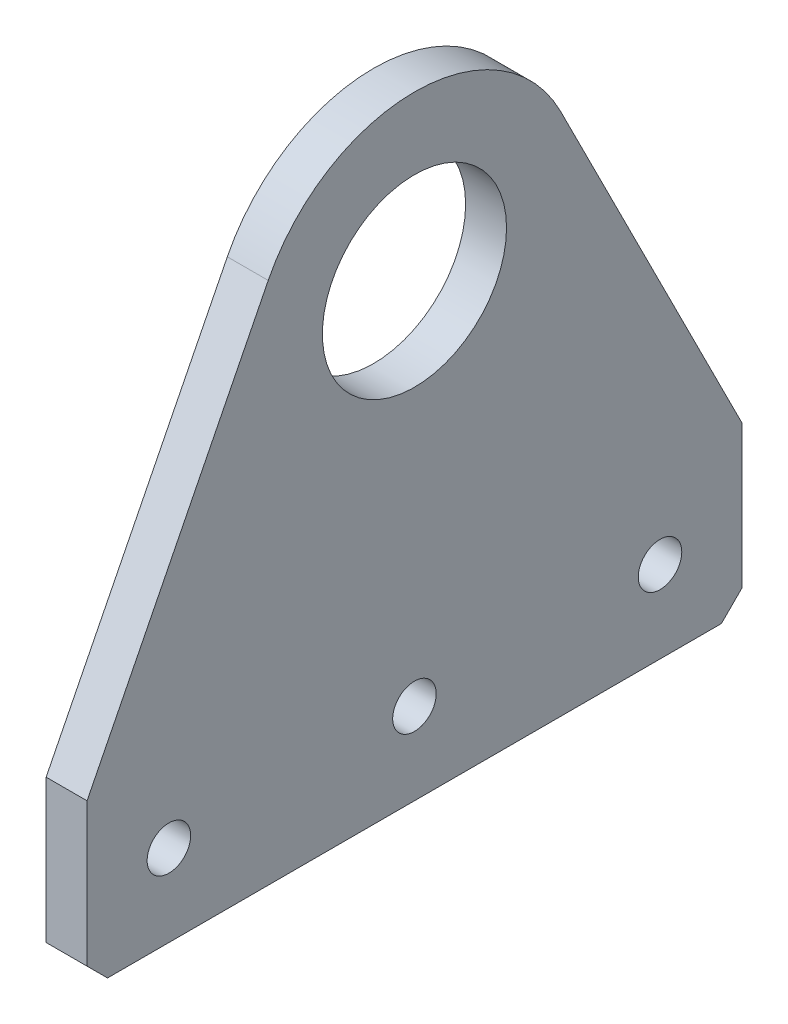
ISO-10303-21;
HEADER;
FILE_DESCRIPTION(('STEP AP214'),'2;1');
FILE_NAME('part.step','',(''),(''),'','','');
FILE_SCHEMA(('AUTOMOTIVE_DESIGN { 1 0 10303 214 1 1 1 1 }'));
ENDSEC;
DATA;
#1=APPLICATION_CONTEXT('core data for automotive mechanical design processes');
#2=APPLICATION_PROTOCOL_DEFINITION('international standard','automotive_design',2000,#1);
#3=PRODUCT_CONTEXT('',#1,'mechanical');
#4=PRODUCT('Part','Part','',(#3));
#5=PRODUCT_RELATED_PRODUCT_CATEGORY('part','',(#4));
#6=PRODUCT_DEFINITION_FORMATION('','',#4);
#7=PRODUCT_DEFINITION_CONTEXT('part definition',#1,'design');
#8=PRODUCT_DEFINITION('design','',#6,#7);
#9=PRODUCT_DEFINITION_SHAPE('','',#8);
#10=(LENGTH_UNIT() NAMED_UNIT(*) SI_UNIT(.MILLI.,.METRE.));
#11=(NAMED_UNIT(*) PLANE_ANGLE_UNIT() SI_UNIT($,.RADIAN.));
#12=(NAMED_UNIT(*) SI_UNIT($,.STERADIAN.) SOLID_ANGLE_UNIT());
#13=UNCERTAINTY_MEASURE_WITH_UNIT(LENGTH_MEASURE(1.E-05),#10,'distance_accuracy_value','');
#14=(GEOMETRIC_REPRESENTATION_CONTEXT(3) GLOBAL_UNCERTAINTY_ASSIGNED_CONTEXT((#13)) GLOBAL_UNIT_ASSIGNED_CONTEXT((#10,
#11,#12)) REPRESENTATION_CONTEXT('',''));
#15=CARTESIAN_POINT('',(0.,0.,0.));
#16=DIRECTION('',(0.,0.,1.));
#17=DIRECTION('',(1.,0.,0.));
#18=AXIS2_PLACEMENT_3D('',#15,#16,#17);
#19=CARTESIAN_POINT('',(6.35,69.85,-50.8));
#20=DIRECTION('',(-1.,0.,0.));
#21=DIRECTION('',(0.,0.,1.));
#22=AXIS2_PLACEMENT_3D('',#19,#20,#21);
#23=PLANE('',#22);
#24=CARTESIAN_POINT('',(6.35,12.7,-12.7));
#25=DIRECTION('',(1.,0.,0.));
#26=DIRECTION('',(0.,0.,-1.));
#27=AXIS2_PLACEMENT_3D('',#24,#25,#26);
#28=CIRCLE('',#27,3.3782);
#29=CARTESIAN_POINT('',(6.35,12.7,-16.0782));
#30=VERTEX_POINT('',#29);
#31=EDGE_CURVE('E236',#30,#30,#28,.T.);
#32=ORIENTED_EDGE('',*,*,#31,.F.);
#33=EDGE_LOOP('',(#32));
#34=FACE_BOUND('',#33,.T.);
#35=CARTESIAN_POINT('',(6.35,12.7,-50.8));
#36=DIRECTION('',(1.,0.,0.));
#37=DIRECTION('',(0.,0.,-1.));
#38=AXIS2_PLACEMENT_3D('',#35,#36,#37);
#39=CIRCLE('',#38,3.3782);
#40=CARTESIAN_POINT('',(6.35,12.7,-54.1782));
#41=VERTEX_POINT('',#40);
#42=EDGE_CURVE('E245',#41,#41,#39,.T.);
#43=ORIENTED_EDGE('',*,*,#42,.F.);
#44=EDGE_LOOP('',(#43));
#45=FACE_BOUND('',#44,.T.);
#46=CARTESIAN_POINT('',(6.35,12.7,-88.9));
#47=DIRECTION('',(1.,0.,0.));
#48=DIRECTION('',(0.,0.,-1.));
#49=AXIS2_PLACEMENT_3D('',#46,#47,#48);
#50=CIRCLE('',#49,3.37819999999999);
#51=CARTESIAN_POINT('',(6.35,12.7,-92.2782));
#52=VERTEX_POINT('',#51);
#53=EDGE_CURVE('E239',#52,#52,#50,.T.);
#54=ORIENTED_EDGE('',*,*,#53,.F.);
#55=EDGE_LOOP('',(#54));
#56=FACE_BOUND('',#55,.T.);
#57=DIRECTION('',(0.,0.,-1.));
#58=VECTOR('',#57,1.);
#59=CARTESIAN_POINT('',(6.35,0.,-101.6));
#60=LINE('',#59,#58);
#61=CARTESIAN_POINT('',(6.35,0.,-3.17500000000001));
#62=VERTEX_POINT('',#61);
#63=CARTESIAN_POINT('',(6.35,0.,-98.425));
#64=VERTEX_POINT('',#63);
#65=EDGE_CURVE('E118',#62,#64,#60,.T.);
#66=ORIENTED_EDGE('',*,*,#65,.T.);
#67=DIRECTION('',(0.,-0.707106781186548,0.707106781186548));
#68=VECTOR('',#67,1.);
#69=CARTESIAN_POINT('',(6.35,3.17500000000001,-101.6));
#70=LINE('',#69,#68);
#71=CARTESIAN_POINT('',(6.35,3.17500000000001,-101.6));
#72=VERTEX_POINT('',#71);
#73=EDGE_CURVE('E50',#64,#72,#70,.F.);
#74=ORIENTED_EDGE('',*,*,#73,.T.);
#75=DIRECTION('',(0.,1.,0.));
#76=VECTOR('',#75,1.);
#77=CARTESIAN_POINT('',(6.35,25.4,-101.6));
#78=LINE('',#77,#76);
#79=CARTESIAN_POINT('',(6.35,25.4,-101.6));
#80=VERTEX_POINT('',#79);
#81=EDGE_CURVE('E108',#72,#80,#78,.T.);
#82=ORIENTED_EDGE('',*,*,#81,.T.);
#83=DIRECTION('',(0.,0.893292076217458,0.449476658534237));
#84=VECTOR('',#83,1.);
#85=CARTESIAN_POINT('',(6.35,81.2667071267696,-73.4896187359234));
#86=LINE('',#85,#84);
#87=CARTESIAN_POINT('',(6.35,81.2667071267696,-73.4896187359234));
#88=VERTEX_POINT('',#87);
#89=EDGE_CURVE('E112',#80,#88,#86,.T.);
#90=ORIENTED_EDGE('',*,*,#89,.T.);
#91=CARTESIAN_POINT('',(6.35,69.85,-50.8));
#92=DIRECTION('',(1.,0.,0.));
#93=DIRECTION('',(0.,0.,1.));
#94=AXIS2_PLACEMENT_3D('',#91,#92,#93);
#95=CIRCLE('',#94,25.4);
#96=CARTESIAN_POINT('',(6.35,81.2667071267696,-28.1103812640766));
#97=VERTEX_POINT('',#96);
#98=EDGE_CURVE('E133',#88,#97,#95,.T.);
#99=ORIENTED_EDGE('',*,*,#98,.T.);
#100=DIRECTION('',(0.,-0.893292076217458,0.449476658534238));
#101=VECTOR('',#100,1.);
#102=CARTESIAN_POINT('',(6.35,25.4,0.));
#103=LINE('',#102,#101);
#104=CARTESIAN_POINT('',(6.35,25.4,0.));
#105=VERTEX_POINT('',#104);
#106=EDGE_CURVE('E135',#97,#105,#103,.T.);
#107=ORIENTED_EDGE('',*,*,#106,.T.);
#108=DIRECTION('',(0.,-1.,0.));
#109=VECTOR('',#108,1.);
#110=CARTESIAN_POINT('',(6.35,0.,0.));
#111=LINE('',#110,#109);
#112=CARTESIAN_POINT('',(6.35,3.17500000000001,0.));
#113=VERTEX_POINT('',#112);
#114=EDGE_CURVE('E140',#105,#113,#111,.T.);
#115=ORIENTED_EDGE('',*,*,#114,.T.);
#116=DIRECTION('',(0.,0.707106781186548,0.707106781186548));
#117=VECTOR('',#116,1.);
#118=CARTESIAN_POINT('',(6.35,0.,-3.17500000000001));
#119=LINE('',#118,#117);
#120=EDGE_CURVE('E170',#113,#62,#119,.F.);
#121=ORIENTED_EDGE('',*,*,#120,.T.);
#122=EDGE_LOOP('',(#66,#74,#82,#90,#99,#107,#115,#121));
#123=FACE_BOUND('',#122,.T.);
#124=CARTESIAN_POINT('',(6.35,69.85,-50.8));
#125=DIRECTION('',(1.,0.,0.));
#126=DIRECTION('',(0.,0.,-1.));
#127=AXIS2_PLACEMENT_3D('',#124,#125,#126);
#128=CIRCLE('',#127,14.2875);
#129=CARTESIAN_POINT('',(6.35,69.85,-65.0875));
#130=VERTEX_POINT('',#129);
#131=EDGE_CURVE('E145',#130,#130,#128,.T.);
#132=ORIENTED_EDGE('',*,*,#131,.F.);
#133=EDGE_LOOP('',(#132));
#134=FACE_BOUND('',#133,.T.);
#135=ADVANCED_FACE('F41',(#34,#45,#56,#123,#134),#23,.F.);
#136=CARTESIAN_POINT('',(0.,69.85,-50.8));
#137=DIRECTION('',(-1.,0.,0.));
#138=DIRECTION('',(0.,0.,1.));
#139=AXIS2_PLACEMENT_3D('',#136,#137,#138);
#140=PLANE('',#139);
#141=CARTESIAN_POINT('',(0.,12.7,-12.7));
#142=DIRECTION('',(1.,0.,0.));
#143=DIRECTION('',(0.,0.,-1.));
#144=AXIS2_PLACEMENT_3D('',#141,#142,#143);
#145=CIRCLE('',#144,3.3782);
#146=CARTESIAN_POINT('',(0.,12.7,-16.0782));
#147=VERTEX_POINT('',#146);
#148=EDGE_CURVE('E232',#147,#147,#145,.T.);
#149=ORIENTED_EDGE('',*,*,#148,.T.);
#150=EDGE_LOOP('',(#149));
#151=FACE_BOUND('',#150,.T.);
#152=CARTESIAN_POINT('',(0.,12.7,-50.8));
#153=DIRECTION('',(1.,0.,0.));
#154=DIRECTION('',(0.,0.,-1.));
#155=AXIS2_PLACEMENT_3D('',#152,#153,#154);
#156=CIRCLE('',#155,3.3782);
#157=CARTESIAN_POINT('',(0.,12.7,-54.1782));
#158=VERTEX_POINT('',#157);
#159=EDGE_CURVE('E248',#158,#158,#156,.T.);
#160=ORIENTED_EDGE('',*,*,#159,.T.);
#161=EDGE_LOOP('',(#160));
#162=FACE_BOUND('',#161,.T.);
#163=CARTESIAN_POINT('',(0.,12.7,-88.9));
#164=DIRECTION('',(1.,0.,0.));
#165=DIRECTION('',(0.,0.,-1.));
#166=AXIS2_PLACEMENT_3D('',#163,#164,#165);
#167=CIRCLE('',#166,3.37819999999999);
#168=CARTESIAN_POINT('',(0.,12.7,-92.2782));
#169=VERTEX_POINT('',#168);
#170=EDGE_CURVE('E242',#169,#169,#167,.T.);
#171=ORIENTED_EDGE('',*,*,#170,.T.);
#172=EDGE_LOOP('',(#171));
#173=FACE_BOUND('',#172,.T.);
#174=DIRECTION('',(0.,1.,0.));
#175=VECTOR('',#174,1.);
#176=CARTESIAN_POINT('',(0.,25.4,-101.6));
#177=LINE('',#176,#175);
#178=CARTESIAN_POINT('',(0.,3.17500000000001,-101.6));
#179=VERTEX_POINT('',#178);
#180=CARTESIAN_POINT('',(0.,25.4,-101.6));
#181=VERTEX_POINT('',#180);
#182=EDGE_CURVE('E124',#179,#181,#177,.T.);
#183=ORIENTED_EDGE('',*,*,#182,.F.);
#184=DIRECTION('',(0.,0.707106781186548,-0.707106781186548));
#185=VECTOR('',#184,1.);
#186=CARTESIAN_POINT('',(0.,11.1125,-109.5375));
#187=LINE('',#186,#185);
#188=CARTESIAN_POINT('',(0.,0.,-98.425));
#189=VERTEX_POINT('',#188);
#190=EDGE_CURVE('E164',#179,#189,#187,.F.);
#191=ORIENTED_EDGE('',*,*,#190,.T.);
#192=DIRECTION('',(0.,0.,-1.));
#193=VECTOR('',#192,1.);
#194=CARTESIAN_POINT('',(0.,0.,-101.6));
#195=LINE('',#194,#193);
#196=CARTESIAN_POINT('',(0.,0.,-3.17500000000001));
#197=VERTEX_POINT('',#196);
#198=EDGE_CURVE('E143',#197,#189,#195,.T.);
#199=ORIENTED_EDGE('',*,*,#198,.F.);
#200=DIRECTION('',(0.,-0.707106781186548,-0.707106781186548));
#201=VECTOR('',#200,1.);
#202=CARTESIAN_POINT('',(0.,11.1125,7.93749999999998));
#203=LINE('',#202,#201);
#204=CARTESIAN_POINT('',(0.,3.17500000000001,0.));
#205=VERTEX_POINT('',#204);
#206=EDGE_CURVE('E162',#197,#205,#203,.F.);
#207=ORIENTED_EDGE('',*,*,#206,.T.);
#208=DIRECTION('',(0.,-1.,0.));
#209=VECTOR('',#208,1.);
#210=CARTESIAN_POINT('',(0.,0.,0.));
#211=LINE('',#210,#209);
#212=CARTESIAN_POINT('',(0.,25.4,0.));
#213=VERTEX_POINT('',#212);
#214=EDGE_CURVE('E153',#213,#205,#211,.T.);
#215=ORIENTED_EDGE('',*,*,#214,.F.);
#216=DIRECTION('',(0.,-0.893292076217458,0.449476658534238));
#217=VECTOR('',#216,1.);
#218=CARTESIAN_POINT('',(0.,25.4,0.));
#219=LINE('',#218,#217);
#220=CARTESIAN_POINT('',(0.,81.2667071267696,-28.1103812640766));
#221=VERTEX_POINT('',#220);
#222=EDGE_CURVE('E151',#221,#213,#219,.T.);
#223=ORIENTED_EDGE('',*,*,#222,.F.);
#224=CARTESIAN_POINT('',(0.,69.85,-50.8));
#225=DIRECTION('',(1.,0.,0.));
#226=DIRECTION('',(0.,0.,1.));
#227=AXIS2_PLACEMENT_3D('',#224,#225,#226);
#228=CIRCLE('',#227,25.4);
#229=CARTESIAN_POINT('',(0.,81.2667071267696,-73.4896187359234));
#230=VERTEX_POINT('',#229);
#231=EDGE_CURVE('E149',#230,#221,#228,.T.);
#232=ORIENTED_EDGE('',*,*,#231,.F.);
#233=DIRECTION('',(0.,0.893292076217458,0.449476658534237));
#234=VECTOR('',#233,1.);
#235=CARTESIAN_POINT('',(0.,81.2667071267696,-73.4896187359234));
#236=LINE('',#235,#234);
#237=EDGE_CURVE('E147',#181,#230,#236,.T.);
#238=ORIENTED_EDGE('',*,*,#237,.F.);
#239=EDGE_LOOP('',(#183,#191,#199,#207,#215,#223,#232,#238));
#240=FACE_BOUND('',#239,.T.);
#241=CARTESIAN_POINT('',(0.,69.85,-50.8));
#242=DIRECTION('',(1.,0.,0.));
#243=DIRECTION('',(0.,0.,-1.));
#244=AXIS2_PLACEMENT_3D('',#241,#242,#243);
#245=CIRCLE('',#244,14.2875);
#246=CARTESIAN_POINT('',(0.,69.85,-65.0875));
#247=VERTEX_POINT('',#246);
#248=EDGE_CURVE('E231',#247,#247,#245,.T.);
#249=ORIENTED_EDGE('',*,*,#248,.T.);
#250=EDGE_LOOP('',(#249));
#251=FACE_BOUND('',#250,.T.);
#252=ADVANCED_FACE('F178',(#151,#162,#173,#240,#251),#140,.T.);
#253=CARTESIAN_POINT('',(6.35,0.,-101.6));
#254=DIRECTION('',(0.,1.,0.));
#255=DIRECTION('',(0.,0.,1.));
#256=AXIS2_PLACEMENT_3D('',#253,#254,#255);
#257=PLANE('',#256);
#258=ORIENTED_EDGE('',*,*,#198,.T.);
#259=DIRECTION('',(1.,0.,0.));
#260=VECTOR('',#259,1.);
#261=CARTESIAN_POINT('',(6.35,0.,-98.425));
#262=LINE('',#261,#260);
#263=EDGE_CURVE('E63',#189,#64,#262,.T.);
#264=ORIENTED_EDGE('',*,*,#263,.T.);
#265=ORIENTED_EDGE('',*,*,#65,.F.);
#266=DIRECTION('',(-1.,0.,0.));
#267=VECTOR('',#266,1.);
#268=CARTESIAN_POINT('',(6.35,0.,-3.17500000000001));
#269=LINE('',#268,#267);
#270=EDGE_CURVE('E166',#62,#197,#269,.T.);
#271=ORIENTED_EDGE('',*,*,#270,.T.);
#272=EDGE_LOOP('',(#258,#264,#265,#271));
#273=FACE_BOUND('',#272,.T.);
#274=ADVANCED_FACE('F174',(#273),#257,.F.);
#275=CARTESIAN_POINT('',(6.35,25.4,-101.6));
#276=DIRECTION('',(0.,0.,1.));
#277=DIRECTION('',(1.,0.,0.));
#278=AXIS2_PLACEMENT_3D('',#275,#276,#277);
#279=PLANE('',#278);
#280=ORIENTED_EDGE('',*,*,#81,.F.);
#281=DIRECTION('',(-1.,0.,0.));
#282=VECTOR('',#281,1.);
#283=CARTESIAN_POINT('',(6.35,3.17500000000001,-101.6));
#284=LINE('',#283,#282);
#285=EDGE_CURVE('E127',#72,#179,#284,.T.);
#286=ORIENTED_EDGE('',*,*,#285,.T.);
#287=ORIENTED_EDGE('',*,*,#182,.T.);
#288=DIRECTION('',(-1.,0.,0.));
#289=VECTOR('',#288,1.);
#290=CARTESIAN_POINT('',(6.35,25.4,-101.6));
#291=LINE('',#290,#289);
#292=EDGE_CURVE('E121',#80,#181,#291,.T.);
#293=ORIENTED_EDGE('',*,*,#292,.F.);
#294=EDGE_LOOP('',(#280,#286,#287,#293));
#295=FACE_BOUND('',#294,.T.);
#296=ADVANCED_FACE('F122',(#295),#279,.F.);
#297=CARTESIAN_POINT('',(6.35,81.2667071267696,-73.4896187359234));
#298=DIRECTION('',(0.,-0.449476658534237,0.893292076217458));
#299=DIRECTION('',(0.,-0.893292076217458,-0.449476658534238));
#300=AXIS2_PLACEMENT_3D('',#297,#298,#299);
#301=PLANE('',#300);
#302=ORIENTED_EDGE('',*,*,#237,.T.);
#303=DIRECTION('',(-1.,0.,0.));
#304=VECTOR('',#303,1.);
#305=CARTESIAN_POINT('',(6.35,81.2667071267696,-73.4896187359234));
#306=LINE('',#305,#304);
#307=EDGE_CURVE('E128',#88,#230,#306,.T.);
#308=ORIENTED_EDGE('',*,*,#307,.F.);
#309=ORIENTED_EDGE('',*,*,#89,.F.);
#310=ORIENTED_EDGE('',*,*,#292,.T.);
#311=EDGE_LOOP('',(#302,#308,#309,#310));
#312=FACE_BOUND('',#311,.T.);
#313=ADVANCED_FACE('F130',(#312),#301,.F.);
#314=CARTESIAN_POINT('',(6.35,69.85,-50.8));
#315=DIRECTION('',(-1.,0.,0.));
#316=DIRECTION('',(0.,0.,1.));
#317=AXIS2_PLACEMENT_3D('',#314,#315,#316);
#318=CYLINDRICAL_SURFACE('',#317,25.4);
#319=ORIENTED_EDGE('',*,*,#231,.T.);
#320=DIRECTION('',(-1.,0.,0.));
#321=VECTOR('',#320,1.);
#322=CARTESIAN_POINT('',(6.35,81.2667071267696,-28.1103812640766));
#323=LINE('',#322,#321);
#324=EDGE_CURVE('E157',#97,#221,#323,.T.);
#325=ORIENTED_EDGE('',*,*,#324,.F.);
#326=ORIENTED_EDGE('',*,*,#98,.F.);
#327=ORIENTED_EDGE('',*,*,#307,.T.);
#328=EDGE_LOOP('',(#319,#325,#326,#327));
#329=FACE_BOUND('',#328,.T.);
#330=ADVANCED_FACE('F189',(#329),#318,.T.);
#331=CARTESIAN_POINT('',(6.35,25.4,0.));
#332=DIRECTION('',(0.,-0.449476658534238,-0.893292076217458));
#333=DIRECTION('',(0.,0.893292076217458,-0.449476658534238));
#334=AXIS2_PLACEMENT_3D('',#331,#332,#333);
#335=PLANE('',#334);
#336=ORIENTED_EDGE('',*,*,#222,.T.);
#337=DIRECTION('',(-1.,0.,0.));
#338=VECTOR('',#337,1.);
#339=CARTESIAN_POINT('',(6.35,25.4,0.));
#340=LINE('',#339,#338);
#341=EDGE_CURVE('E142',#105,#213,#340,.T.);
#342=ORIENTED_EDGE('',*,*,#341,.F.);
#343=ORIENTED_EDGE('',*,*,#106,.F.);
#344=ORIENTED_EDGE('',*,*,#324,.T.);
#345=EDGE_LOOP('',(#336,#342,#343,#344));
#346=FACE_BOUND('',#345,.T.);
#347=ADVANCED_FACE('F185',(#346),#335,.F.);
#348=CARTESIAN_POINT('',(6.35,0.,0.));
#349=DIRECTION('',(0.,0.,-1.));
#350=DIRECTION('',(-1.,0.,0.));
#351=AXIS2_PLACEMENT_3D('',#348,#349,#350);
#352=PLANE('',#351);
#353=ORIENTED_EDGE('',*,*,#214,.T.);
#354=DIRECTION('',(1.,0.,0.));
#355=VECTOR('',#354,1.);
#356=CARTESIAN_POINT('',(6.35,3.17500000000001,0.));
#357=LINE('',#356,#355);
#358=EDGE_CURVE('E11',#205,#113,#357,.T.);
#359=ORIENTED_EDGE('',*,*,#358,.T.);
#360=ORIENTED_EDGE('',*,*,#114,.F.);
#361=ORIENTED_EDGE('',*,*,#341,.T.);
#362=EDGE_LOOP('',(#353,#359,#360,#361));
#363=FACE_BOUND('',#362,.T.);
#364=ADVANCED_FACE('F181',(#363),#352,.F.);
#365=CARTESIAN_POINT('',(6.35,69.85,-50.8));
#366=DIRECTION('',(-1.,0.,0.));
#367=DIRECTION('',(0.,0.,1.));
#368=AXIS2_PLACEMENT_3D('',#365,#366,#367);
#369=CYLINDRICAL_SURFACE('',#368,14.2875);
#370=ORIENTED_EDGE('',*,*,#131,.T.);
#371=EDGE_LOOP('',(#370));
#372=FACE_BOUND('',#371,.T.);
#373=ORIENTED_EDGE('',*,*,#248,.F.);
#374=EDGE_LOOP('',(#373));
#375=FACE_BOUND('',#374,.T.);
#376=ADVANCED_FACE('F210',(#372,#375),#369,.F.);
#377=CARTESIAN_POINT('',(0.,12.7,-88.9));
#378=DIRECTION('',(1.,0.,0.));
#379=DIRECTION('',(0.,0.,-1.));
#380=AXIS2_PLACEMENT_3D('',#377,#378,#379);
#381=CYLINDRICAL_SURFACE('',#380,3.37819999999999);
#382=ORIENTED_EDGE('',*,*,#170,.F.);
#383=EDGE_LOOP('',(#382));
#384=FACE_BOUND('',#383,.T.);
#385=ORIENTED_EDGE('',*,*,#53,.T.);
#386=EDGE_LOOP('',(#385));
#387=FACE_BOUND('',#386,.T.);
#388=ADVANCED_FACE('F219',(#384,#387),#381,.F.);
#389=CARTESIAN_POINT('',(0.,12.7,-50.8));
#390=DIRECTION('',(1.,0.,0.));
#391=DIRECTION('',(0.,0.,-1.));
#392=AXIS2_PLACEMENT_3D('',#389,#390,#391);
#393=CYLINDRICAL_SURFACE('',#392,3.3782);
#394=ORIENTED_EDGE('',*,*,#159,.F.);
#395=EDGE_LOOP('',(#394));
#396=FACE_BOUND('',#395,.T.);
#397=ORIENTED_EDGE('',*,*,#42,.T.);
#398=EDGE_LOOP('',(#397));
#399=FACE_BOUND('',#398,.T.);
#400=ADVANCED_FACE('F224',(#396,#399),#393,.F.);
#401=CARTESIAN_POINT('',(0.,12.7,-12.7));
#402=DIRECTION('',(1.,0.,0.));
#403=DIRECTION('',(0.,0.,-1.));
#404=AXIS2_PLACEMENT_3D('',#401,#402,#403);
#405=CYLINDRICAL_SURFACE('',#404,3.3782);
#406=ORIENTED_EDGE('',*,*,#148,.F.);
#407=EDGE_LOOP('',(#406));
#408=FACE_BOUND('',#407,.T.);
#409=ORIENTED_EDGE('',*,*,#31,.T.);
#410=EDGE_LOOP('',(#409));
#411=FACE_BOUND('',#410,.T.);
#412=ADVANCED_FACE('F253',(#408,#411),#405,.F.);
#413=CARTESIAN_POINT('',(6.35,3.17500000000001,-101.6));
#414=DIRECTION('',(0.,0.707106781186548,0.707106781186548));
#415=DIRECTION('',(-1.,0.,0.));
#416=AXIS2_PLACEMENT_3D('',#413,#414,#415);
#417=PLANE('',#416);
#418=ORIENTED_EDGE('',*,*,#73,.F.);
#419=ORIENTED_EDGE('',*,*,#263,.F.);
#420=ORIENTED_EDGE('',*,*,#190,.F.);
#421=ORIENTED_EDGE('',*,*,#285,.F.);
#422=EDGE_LOOP('',(#418,#419,#420,#421));
#423=FACE_BOUND('',#422,.T.);
#424=ADVANCED_FACE('F255',(#423),#417,.F.);
#425=CARTESIAN_POINT('',(6.35,0.,-3.17500000000001));
#426=DIRECTION('',(0.,0.707106781186548,-0.707106781186548));
#427=DIRECTION('',(-1.,0.,0.));
#428=AXIS2_PLACEMENT_3D('',#425,#426,#427);
#429=PLANE('',#428);
#430=ORIENTED_EDGE('',*,*,#120,.F.);
#431=ORIENTED_EDGE('',*,*,#358,.F.);
#432=ORIENTED_EDGE('',*,*,#206,.F.);
#433=ORIENTED_EDGE('',*,*,#270,.F.);
#434=EDGE_LOOP('',(#430,#431,#432,#433));
#435=FACE_BOUND('',#434,.T.);
#436=ADVANCED_FACE('F44',(#435),#429,.F.);
#437=CLOSED_SHELL('',(#135,#252,#274,#296,#313,#330,#347,#364,#376,#388,#400,#412,#424,#436));
#438=MANIFOLD_SOLID_BREP('B2',#437);
#439=ADVANCED_BREP_SHAPE_REPRESENTATION('',(#18,#438),#14);
#440=SHAPE_DEFINITION_REPRESENTATION(#9,#439);
ENDSEC;
END-ISO-10303-21;
